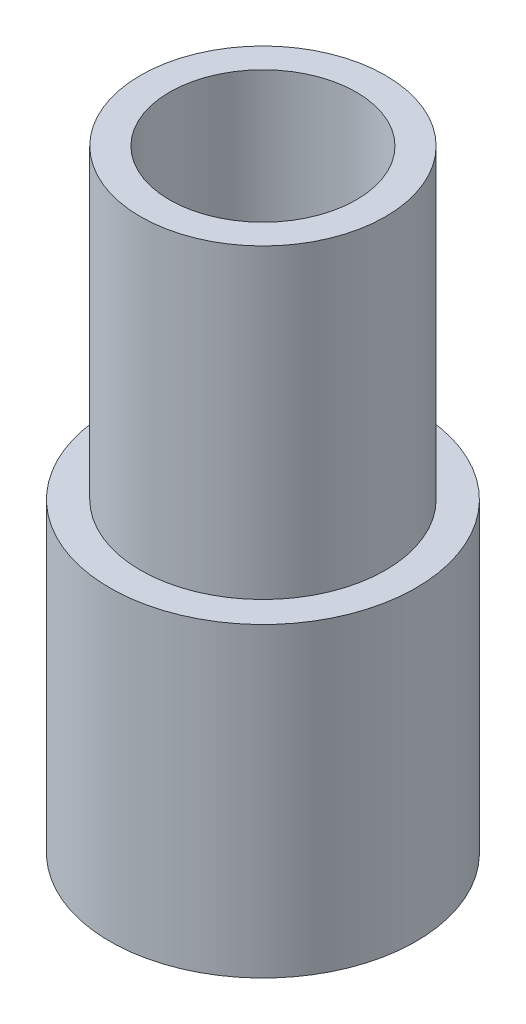
ISO-10303-21;
HEADER;
FILE_DESCRIPTION(('STEP AP214'),'2;1');
FILE_NAME('part.step','',(''),(''),'','','');
FILE_SCHEMA(('AUTOMOTIVE_DESIGN { 1 0 10303 214 1 1 1 1 }'));
ENDSEC;
DATA;
#1=APPLICATION_CONTEXT('core data for automotive mechanical design processes');
#2=APPLICATION_PROTOCOL_DEFINITION('international standard','automotive_design',2000,#1);
#3=PRODUCT_CONTEXT('',#1,'mechanical');
#4=PRODUCT('Part','Part','',(#3));
#5=PRODUCT_RELATED_PRODUCT_CATEGORY('part','',(#4));
#6=PRODUCT_DEFINITION_FORMATION('','',#4);
#7=PRODUCT_DEFINITION_CONTEXT('part definition',#1,'design');
#8=PRODUCT_DEFINITION('design','',#6,#7);
#9=PRODUCT_DEFINITION_SHAPE('','',#8);
#10=(LENGTH_UNIT() NAMED_UNIT(*) SI_UNIT(.MILLI.,.METRE.));
#11=(NAMED_UNIT(*) PLANE_ANGLE_UNIT() SI_UNIT($,.RADIAN.));
#12=(NAMED_UNIT(*) SI_UNIT($,.STERADIAN.) SOLID_ANGLE_UNIT());
#13=UNCERTAINTY_MEASURE_WITH_UNIT(LENGTH_MEASURE(1.E-05),#10,'distance_accuracy_value','');
#14=(GEOMETRIC_REPRESENTATION_CONTEXT(3) GLOBAL_UNCERTAINTY_ASSIGNED_CONTEXT((#13)) GLOBAL_UNIT_ASSIGNED_CONTEXT((#10,
#11,#12)) REPRESENTATION_CONTEXT('',''));
#15=CARTESIAN_POINT('',(0.,0.,0.));
#16=DIRECTION('',(0.,0.,1.));
#17=DIRECTION('',(1.,0.,0.));
#18=AXIS2_PLACEMENT_3D('',#15,#16,#17);
#19=CARTESIAN_POINT('',(0.,10.,0.));
#20=DIRECTION('',(0.,-1.,0.));
#21=DIRECTION('',(0.,0.,-1.));
#22=AXIS2_PLACEMENT_3D('',#19,#20,#21);
#23=CYLINDRICAL_SURFACE('',#22,4.);
#24=CARTESIAN_POINT('',(0.,10.,0.));
#25=DIRECTION('',(0.,1.,0.));
#26=DIRECTION('',(0.,0.,1.));
#27=AXIS2_PLACEMENT_3D('',#24,#25,#26);
#28=CIRCLE('',#27,4.);
#29=CARTESIAN_POINT('',(0.,10.,4.));
#30=VERTEX_POINT('',#29);
#31=EDGE_CURVE('E10',#30,#30,#28,.T.);
#32=ORIENTED_EDGE('',*,*,#31,.F.);
#33=EDGE_LOOP('',(#32));
#34=FACE_BOUND('',#33,.T.);
#35=CARTESIAN_POINT('',(0.,0.,0.));
#36=DIRECTION('',(0.,1.,0.));
#37=DIRECTION('',(0.,0.,1.));
#38=AXIS2_PLACEMENT_3D('',#35,#36,#37);
#39=CIRCLE('',#38,4.);
#40=CARTESIAN_POINT('',(0.,0.,4.));
#41=VERTEX_POINT('',#40);
#42=EDGE_CURVE('E40',#41,#41,#39,.T.);
#43=ORIENTED_EDGE('',*,*,#42,.T.);
#44=EDGE_LOOP('',(#43));
#45=FACE_BOUND('',#44,.T.);
#46=ADVANCED_FACE('F37',(#34,#45),#23,.T.);
#47=CARTESIAN_POINT('',(0.,10.,0.));
#48=DIRECTION('',(0.,1.,0.));
#49=DIRECTION('',(0.,0.,1.));
#50=AXIS2_PLACEMENT_3D('',#47,#48,#49);
#51=PLANE('',#50);
#52=CARTESIAN_POINT('',(0.,10.,0.));
#53=DIRECTION('',(0.,1.,0.));
#54=DIRECTION('',(0.,0.,1.));
#55=AXIS2_PLACEMENT_3D('',#52,#53,#54);
#56=CIRCLE('',#55,3.05);
#57=CARTESIAN_POINT('',(0.,10.,3.05));
#58=VERTEX_POINT('',#57);
#59=EDGE_CURVE('E50',#58,#58,#56,.T.);
#60=ORIENTED_EDGE('',*,*,#59,.F.);
#61=EDGE_LOOP('',(#60));
#62=FACE_BOUND('',#61,.T.);
#63=ORIENTED_EDGE('',*,*,#31,.T.);
#64=EDGE_LOOP('',(#63));
#65=FACE_BOUND('',#64,.T.);
#66=ADVANCED_FACE('F102',(#62,#65),#51,.T.);
#67=CARTESIAN_POINT('',(0.,2.,0.));
#68=DIRECTION('',(0.,1.,0.));
#69=DIRECTION('',(0.,0.,1.));
#70=AXIS2_PLACEMENT_3D('',#67,#68,#69);
#71=CYLINDRICAL_SURFACE('',#70,3.05);
#72=CARTESIAN_POINT('',(0.,2.,0.));
#73=DIRECTION('',(0.,1.,0.));
#74=DIRECTION('',(0.,0.,1.));
#75=AXIS2_PLACEMENT_3D('',#72,#73,#74);
#76=CIRCLE('',#75,3.05);
#77=CARTESIAN_POINT('',(0.,2.,3.05));
#78=VERTEX_POINT('',#77);
#79=EDGE_CURVE('E45',#78,#78,#76,.T.);
#80=ORIENTED_EDGE('',*,*,#79,.F.);
#81=EDGE_LOOP('',(#80));
#82=FACE_BOUND('',#81,.T.);
#83=ORIENTED_EDGE('',*,*,#59,.T.);
#84=EDGE_LOOP('',(#83));
#85=FACE_BOUND('',#84,.T.);
#86=ADVANCED_FACE('F107',(#82,#85),#71,.F.);
#87=CARTESIAN_POINT('',(0.,2.,0.));
#88=DIRECTION('',(0.,1.,0.));
#89=DIRECTION('',(0.,0.,1.));
#90=AXIS2_PLACEMENT_3D('',#87,#88,#89);
#91=PLANE('',#90);
#92=ORIENTED_EDGE('',*,*,#79,.T.);
#93=EDGE_LOOP('',(#92));
#94=FACE_BOUND('',#93,.T.);
#95=ADVANCED_FACE('F91',(#94),#91,.T.);
#96=CARTESIAN_POINT('',(0.,-10.,0.));
#97=DIRECTION('',(0.,1.,0.));
#98=DIRECTION('',(0.,0.,1.));
#99=AXIS2_PLACEMENT_3D('',#96,#97,#98);
#100=CYLINDRICAL_SURFACE('',#99,5.);
#101=CARTESIAN_POINT('',(0.,-10.,0.));
#102=DIRECTION('',(0.,-1.,0.));
#103=DIRECTION('',(0.,0.,-1.));
#104=AXIS2_PLACEMENT_3D('',#101,#102,#103);
#105=CIRCLE('',#104,5.);
#106=CARTESIAN_POINT('',(0.,-10.,-5.));
#107=VERTEX_POINT('',#106);
#108=EDGE_CURVE('E60',#107,#107,#105,.T.);
#109=ORIENTED_EDGE('',*,*,#108,.F.);
#110=EDGE_LOOP('',(#109));
#111=FACE_BOUND('',#110,.T.);
#112=CARTESIAN_POINT('',(0.,0.,0.));
#113=DIRECTION('',(0.,-1.,0.));
#114=DIRECTION('',(0.,0.,-1.));
#115=AXIS2_PLACEMENT_3D('',#112,#113,#114);
#116=CIRCLE('',#115,5.);
#117=CARTESIAN_POINT('',(0.,0.,-5.));
#118=VERTEX_POINT('',#117);
#119=EDGE_CURVE('E56',#118,#118,#116,.T.);
#120=ORIENTED_EDGE('',*,*,#119,.T.);
#121=EDGE_LOOP('',(#120));
#122=FACE_BOUND('',#121,.T.);
#123=ADVANCED_FACE('F85',(#111,#122),#100,.T.);
#124=CARTESIAN_POINT('',(0.,-10.,0.));
#125=DIRECTION('',(0.,-1.,0.));
#126=DIRECTION('',(0.,0.,-1.));
#127=AXIS2_PLACEMENT_3D('',#124,#125,#126);
#128=PLANE('',#127);
#129=CARTESIAN_POINT('',(0.,-10.,0.));
#130=DIRECTION('',(0.,-1.,0.));
#131=DIRECTION('',(0.,0.,-1.));
#132=AXIS2_PLACEMENT_3D('',#129,#130,#131);
#133=CIRCLE('',#132,4.05);
#134=CARTESIAN_POINT('',(0.,-10.,-4.05));
#135=VERTEX_POINT('',#134);
#136=EDGE_CURVE('E65',#135,#135,#133,.T.);
#137=ORIENTED_EDGE('',*,*,#136,.F.);
#138=EDGE_LOOP('',(#137));
#139=FACE_BOUND('',#138,.T.);
#140=ORIENTED_EDGE('',*,*,#108,.T.);
#141=EDGE_LOOP('',(#140));
#142=FACE_BOUND('',#141,.T.);
#143=ADVANCED_FACE('F82',(#139,#142),#128,.T.);
#144=CARTESIAN_POINT('',(0.,0.,0.));
#145=DIRECTION('',(0.,-1.,0.));
#146=DIRECTION('',(0.,0.,-1.));
#147=AXIS2_PLACEMENT_3D('',#144,#145,#146);
#148=PLANE('',#147);
#149=ORIENTED_EDGE('',*,*,#42,.F.);
#150=EDGE_LOOP('',(#149));
#151=FACE_BOUND('',#150,.T.);
#152=ORIENTED_EDGE('',*,*,#119,.F.);
#153=EDGE_LOOP('',(#152));
#154=FACE_BOUND('',#153,.T.);
#155=ADVANCED_FACE('F78',(#151,#154),#148,.F.);
#156=CARTESIAN_POINT('',(0.,-2.,0.));
#157=DIRECTION('',(0.,-1.,0.));
#158=DIRECTION('',(0.,0.,-1.));
#159=AXIS2_PLACEMENT_3D('',#156,#157,#158);
#160=CYLINDRICAL_SURFACE('',#159,4.05);
#161=CARTESIAN_POINT('',(0.,-2.,0.));
#162=DIRECTION('',(0.,-1.,0.));
#163=DIRECTION('',(0.,0.,-1.));
#164=AXIS2_PLACEMENT_3D('',#161,#162,#163);
#165=CIRCLE('',#164,4.05);
#166=CARTESIAN_POINT('',(0.,-2.,-4.05));
#167=VERTEX_POINT('',#166);
#168=EDGE_CURVE('E61',#167,#167,#165,.T.);
#169=ORIENTED_EDGE('',*,*,#168,.F.);
#170=EDGE_LOOP('',(#169));
#171=FACE_BOUND('',#170,.T.);
#172=ORIENTED_EDGE('',*,*,#136,.T.);
#173=EDGE_LOOP('',(#172));
#174=FACE_BOUND('',#173,.T.);
#175=ADVANCED_FACE('F75',(#171,#174),#160,.F.);
#176=CARTESIAN_POINT('',(0.,-2.,0.));
#177=DIRECTION('',(0.,-1.,0.));
#178=DIRECTION('',(0.,0.,-1.));
#179=AXIS2_PLACEMENT_3D('',#176,#177,#178);
#180=PLANE('',#179);
#181=ORIENTED_EDGE('',*,*,#168,.T.);
#182=EDGE_LOOP('',(#181));
#183=FACE_BOUND('',#182,.T.);
#184=ADVANCED_FACE('F73',(#183),#180,.T.);
#185=CLOSED_SHELL('',(#46,#66,#86,#95,#123,#143,#155,#175,#184));
#186=MANIFOLD_SOLID_BREP('B2',#185);
#187=ADVANCED_BREP_SHAPE_REPRESENTATION('',(#18,#186),#14);
#188=SHAPE_DEFINITION_REPRESENTATION(#9,#187);
ENDSEC;
END-ISO-10303-21;
